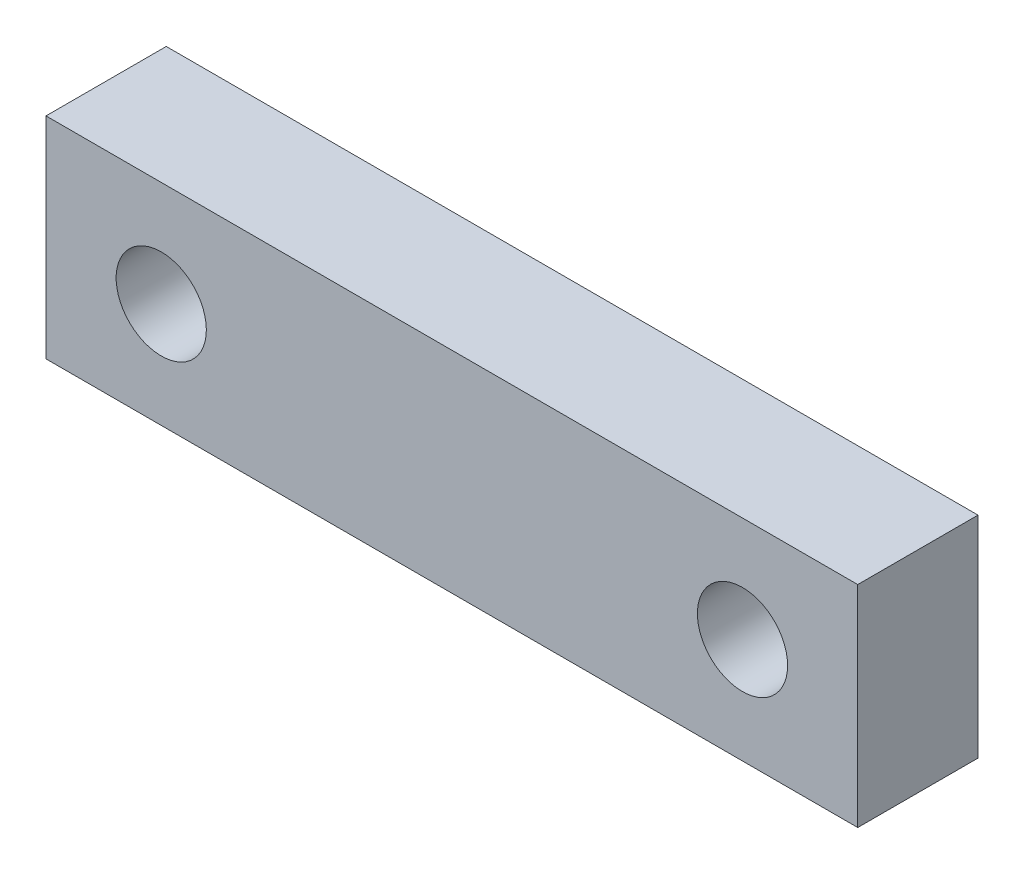
ISO-10303-21;
HEADER;
FILE_DESCRIPTION(('STEP AP214'),'2;1');
FILE_NAME('part.step','',(''),(''),'','','');
FILE_SCHEMA(('AUTOMOTIVE_DESIGN { 1 0 10303 214 1 1 1 1 }'));
ENDSEC;
DATA;
#1=APPLICATION_CONTEXT('core data for automotive mechanical design processes');
#2=APPLICATION_PROTOCOL_DEFINITION('international standard','automotive_design',2000,#1);
#3=PRODUCT_CONTEXT('',#1,'mechanical');
#4=PRODUCT('Part','Part','',(#3));
#5=PRODUCT_RELATED_PRODUCT_CATEGORY('part','',(#4));
#6=PRODUCT_DEFINITION_FORMATION('','',#4);
#7=PRODUCT_DEFINITION_CONTEXT('part definition',#1,'design');
#8=PRODUCT_DEFINITION('design','',#6,#7);
#9=PRODUCT_DEFINITION_SHAPE('','',#8);
#10=(LENGTH_UNIT() NAMED_UNIT(*) SI_UNIT(.MILLI.,.METRE.));
#11=(NAMED_UNIT(*) PLANE_ANGLE_UNIT() SI_UNIT($,.RADIAN.));
#12=(NAMED_UNIT(*) SI_UNIT($,.STERADIAN.) SOLID_ANGLE_UNIT());
#13=UNCERTAINTY_MEASURE_WITH_UNIT(LENGTH_MEASURE(1.E-05),#10,'distance_accuracy_value','');
#14=(GEOMETRIC_REPRESENTATION_CONTEXT(3) GLOBAL_UNCERTAINTY_ASSIGNED_CONTEXT((#13)) GLOBAL_UNIT_ASSIGNED_CONTEXT((#10,
#11,#12)) REPRESENTATION_CONTEXT('',''));
#15=CARTESIAN_POINT('',(0.,0.,0.));
#16=DIRECTION('',(0.,0.,1.));
#17=DIRECTION('',(1.,0.,0.));
#18=AXIS2_PLACEMENT_3D('',#15,#16,#17);
#19=CARTESIAN_POINT('',(-20.25,5.25,-3.));
#20=DIRECTION('',(-1.,0.,0.));
#21=DIRECTION('',(0.,0.,1.));
#22=AXIS2_PLACEMENT_3D('',#19,#20,#21);
#23=PLANE('',#22);
#24=DIRECTION('',(0.,0.,1.));
#25=VECTOR('',#24,1.);
#26=CARTESIAN_POINT('',(-20.25,-5.25,-3.));
#27=LINE('',#26,#25);
#28=CARTESIAN_POINT('',(-20.25,-5.25,-3.));
#29=VERTEX_POINT('',#28);
#30=CARTESIAN_POINT('',(-20.25,-5.25,3.));
#31=VERTEX_POINT('',#30);
#32=EDGE_CURVE('E38',#29,#31,#27,.T.);
#33=ORIENTED_EDGE('',*,*,#32,.T.);
#34=DIRECTION('',(0.,-1.,0.));
#35=VECTOR('',#34,1.);
#36=CARTESIAN_POINT('',(-20.25,5.25,3.));
#37=LINE('',#36,#35);
#38=CARTESIAN_POINT('',(-20.25,5.25,3.));
#39=VERTEX_POINT('',#38);
#40=EDGE_CURVE('E75',#39,#31,#37,.T.);
#41=ORIENTED_EDGE('',*,*,#40,.F.);
#42=DIRECTION('',(0.,0.,1.));
#43=VECTOR('',#42,1.);
#44=CARTESIAN_POINT('',(-20.25,5.25,-3.));
#45=LINE('',#44,#43);
#46=CARTESIAN_POINT('',(-20.25,5.25,-3.));
#47=VERTEX_POINT('',#46);
#48=EDGE_CURVE('E11',#47,#39,#45,.T.);
#49=ORIENTED_EDGE('',*,*,#48,.F.);
#50=DIRECTION('',(0.,-1.,0.));
#51=VECTOR('',#50,1.);
#52=CARTESIAN_POINT('',(-20.25,5.25,-3.));
#53=LINE('',#52,#51);
#54=EDGE_CURVE('E76',#47,#29,#53,.T.);
#55=ORIENTED_EDGE('',*,*,#54,.T.);
#56=EDGE_LOOP('',(#33,#41,#49,#55));
#57=FACE_BOUND('',#56,.T.);
#58=ADVANCED_FACE('F35',(#57),#23,.T.);
#59=CARTESIAN_POINT('',(-20.25,5.25,-3.));
#60=DIRECTION('',(0.,1.,0.));
#61=DIRECTION('',(0.,0.,1.));
#62=AXIS2_PLACEMENT_3D('',#59,#60,#61);
#63=PLANE('',#62);
#64=ORIENTED_EDGE('',*,*,#48,.T.);
#65=DIRECTION('',(-1.,0.,0.));
#66=VECTOR('',#65,1.);
#67=CARTESIAN_POINT('',(-20.25,5.25,3.));
#68=LINE('',#67,#66);
#69=CARTESIAN_POINT('',(20.25,5.25,3.));
#70=VERTEX_POINT('',#69);
#71=EDGE_CURVE('E93',#70,#39,#68,.T.);
#72=ORIENTED_EDGE('',*,*,#71,.F.);
#73=DIRECTION('',(0.,0.,1.));
#74=VECTOR('',#73,1.);
#75=CARTESIAN_POINT('',(20.25,5.25,-3.));
#76=LINE('',#75,#74);
#77=CARTESIAN_POINT('',(20.25,5.25,-3.));
#78=VERTEX_POINT('',#77);
#79=EDGE_CURVE('E43',#78,#70,#76,.T.);
#80=ORIENTED_EDGE('',*,*,#79,.F.);
#81=DIRECTION('',(-1.,0.,0.));
#82=VECTOR('',#81,1.);
#83=CARTESIAN_POINT('',(-20.25,5.25,-3.));
#84=LINE('',#83,#82);
#85=EDGE_CURVE('E81',#78,#47,#84,.T.);
#86=ORIENTED_EDGE('',*,*,#85,.T.);
#87=EDGE_LOOP('',(#64,#72,#80,#86));
#88=FACE_BOUND('',#87,.T.);
#89=ADVANCED_FACE('F119',(#88),#63,.T.);
#90=CARTESIAN_POINT('',(20.25,5.25,-3.));
#91=DIRECTION('',(1.,0.,0.));
#92=DIRECTION('',(0.,0.,-1.));
#93=AXIS2_PLACEMENT_3D('',#90,#91,#92);
#94=PLANE('',#93);
#95=ORIENTED_EDGE('',*,*,#79,.T.);
#96=DIRECTION('',(0.,1.,0.));
#97=VECTOR('',#96,1.);
#98=CARTESIAN_POINT('',(20.25,5.25,3.));
#99=LINE('',#98,#97);
#100=CARTESIAN_POINT('',(20.25,-5.25,3.));
#101=VERTEX_POINT('',#100);
#102=EDGE_CURVE('E88',#101,#70,#99,.T.);
#103=ORIENTED_EDGE('',*,*,#102,.F.);
#104=DIRECTION('',(0.,0.,1.));
#105=VECTOR('',#104,1.);
#106=CARTESIAN_POINT('',(20.25,-5.25,-3.));
#107=LINE('',#106,#105);
#108=CARTESIAN_POINT('',(20.25,-5.25,-3.));
#109=VERTEX_POINT('',#108);
#110=EDGE_CURVE('E80',#109,#101,#107,.T.);
#111=ORIENTED_EDGE('',*,*,#110,.F.);
#112=DIRECTION('',(0.,1.,0.));
#113=VECTOR('',#112,1.);
#114=CARTESIAN_POINT('',(20.25,5.25,-3.));
#115=LINE('',#114,#113);
#116=EDGE_CURVE('E112',#109,#78,#115,.T.);
#117=ORIENTED_EDGE('',*,*,#116,.T.);
#118=EDGE_LOOP('',(#95,#103,#111,#117));
#119=FACE_BOUND('',#118,.T.);
#120=ADVANCED_FACE('F116',(#119),#94,.T.);
#121=CARTESIAN_POINT('',(-20.25,-5.25,-3.));
#122=DIRECTION('',(0.,-1.,0.));
#123=DIRECTION('',(0.,0.,-1.));
#124=AXIS2_PLACEMENT_3D('',#121,#122,#123);
#125=PLANE('',#124);
#126=ORIENTED_EDGE('',*,*,#110,.T.);
#127=DIRECTION('',(1.,0.,0.));
#128=VECTOR('',#127,1.);
#129=CARTESIAN_POINT('',(-20.25,-5.25,3.));
#130=LINE('',#129,#128);
#131=EDGE_CURVE('E83',#31,#101,#130,.T.);
#132=ORIENTED_EDGE('',*,*,#131,.F.);
#133=ORIENTED_EDGE('',*,*,#32,.F.);
#134=DIRECTION('',(1.,0.,0.));
#135=VECTOR('',#134,1.);
#136=CARTESIAN_POINT('',(-20.25,-5.25,-3.));
#137=LINE('',#136,#135);
#138=EDGE_CURVE('E110',#29,#109,#137,.T.);
#139=ORIENTED_EDGE('',*,*,#138,.T.);
#140=EDGE_LOOP('',(#126,#132,#133,#139));
#141=FACE_BOUND('',#140,.T.);
#142=ADVANCED_FACE('F84',(#141),#125,.T.);
#143=CARTESIAN_POINT('',(0.,0.,-3.));
#144=DIRECTION('',(0.,0.,1.));
#145=DIRECTION('',(1.,0.,0.));
#146=AXIS2_PLACEMENT_3D('',#143,#144,#145);
#147=PLANE('',#146);
#148=CARTESIAN_POINT('',(14.5,0.,-3.));
#149=DIRECTION('',(0.,0.,1.));
#150=DIRECTION('',(1.,0.,0.));
#151=AXIS2_PLACEMENT_3D('',#148,#149,#150);
#152=CIRCLE('',#151,2.25);
#153=CARTESIAN_POINT('',(16.75,0.,-3.));
#154=VERTEX_POINT('',#153);
#155=EDGE_CURVE('E103',#154,#154,#152,.T.);
#156=ORIENTED_EDGE('',*,*,#155,.T.);
#157=EDGE_LOOP('',(#156));
#158=FACE_BOUND('',#157,.T.);
#159=CARTESIAN_POINT('',(-14.5,0.,-3.));
#160=DIRECTION('',(0.,0.,1.));
#161=DIRECTION('',(1.,0.,0.));
#162=AXIS2_PLACEMENT_3D('',#159,#160,#161);
#163=CIRCLE('',#162,2.25);
#164=CARTESIAN_POINT('',(-12.25,0.,-3.));
#165=VERTEX_POINT('',#164);
#166=EDGE_CURVE('E106',#165,#165,#163,.T.);
#167=ORIENTED_EDGE('',*,*,#166,.T.);
#168=EDGE_LOOP('',(#167));
#169=FACE_BOUND('',#168,.T.);
#170=ORIENTED_EDGE('',*,*,#54,.F.);
#171=ORIENTED_EDGE('',*,*,#85,.F.);
#172=ORIENTED_EDGE('',*,*,#116,.F.);
#173=ORIENTED_EDGE('',*,*,#138,.F.);
#174=EDGE_LOOP('',(#170,#171,#172,#173));
#175=FACE_BOUND('',#174,.T.);
#176=ADVANCED_FACE('F121',(#158,#169,#175),#147,.F.);
#177=CARTESIAN_POINT('',(-14.5,0.,-3.));
#178=DIRECTION('',(0.,0.,1.));
#179=DIRECTION('',(1.,0.,0.));
#180=AXIS2_PLACEMENT_3D('',#177,#178,#179);
#181=CYLINDRICAL_SURFACE('',#180,2.25);
#182=ORIENTED_EDGE('',*,*,#166,.F.);
#183=EDGE_LOOP('',(#182));
#184=FACE_BOUND('',#183,.T.);
#185=CARTESIAN_POINT('',(-14.5,0.,3.));
#186=DIRECTION('',(0.,0.,1.));
#187=DIRECTION('',(1.,0.,0.));
#188=AXIS2_PLACEMENT_3D('',#185,#186,#187);
#189=CIRCLE('',#188,2.25);
#190=CARTESIAN_POINT('',(-12.25,0.,3.));
#191=VERTEX_POINT('',#190);
#192=EDGE_CURVE('E94',#191,#191,#189,.T.);
#193=ORIENTED_EDGE('',*,*,#192,.T.);
#194=EDGE_LOOP('',(#193));
#195=FACE_BOUND('',#194,.T.);
#196=ADVANCED_FACE('F123',(#184,#195),#181,.F.);
#197=CARTESIAN_POINT('',(14.5,0.,-3.));
#198=DIRECTION('',(0.,0.,1.));
#199=DIRECTION('',(1.,0.,0.));
#200=AXIS2_PLACEMENT_3D('',#197,#198,#199);
#201=CYLINDRICAL_SURFACE('',#200,2.25);
#202=ORIENTED_EDGE('',*,*,#155,.F.);
#203=EDGE_LOOP('',(#202));
#204=FACE_BOUND('',#203,.T.);
#205=CARTESIAN_POINT('',(14.5,0.,3.));
#206=DIRECTION('',(0.,0.,1.));
#207=DIRECTION('',(1.,0.,0.));
#208=AXIS2_PLACEMENT_3D('',#205,#206,#207);
#209=CIRCLE('',#208,2.25);
#210=CARTESIAN_POINT('',(16.75,0.,3.));
#211=VERTEX_POINT('',#210);
#212=EDGE_CURVE('E97',#211,#211,#209,.T.);
#213=ORIENTED_EDGE('',*,*,#212,.T.);
#214=EDGE_LOOP('',(#213));
#215=FACE_BOUND('',#214,.T.);
#216=ADVANCED_FACE('F130',(#204,#215),#201,.F.);
#217=CARTESIAN_POINT('',(0.,0.,3.));
#218=DIRECTION('',(0.,0.,1.));
#219=DIRECTION('',(1.,0.,0.));
#220=AXIS2_PLACEMENT_3D('',#217,#218,#219);
#221=PLANE('',#220);
#222=ORIENTED_EDGE('',*,*,#192,.F.);
#223=EDGE_LOOP('',(#222));
#224=FACE_BOUND('',#223,.T.);
#225=ORIENTED_EDGE('',*,*,#40,.T.);
#226=ORIENTED_EDGE('',*,*,#131,.T.);
#227=ORIENTED_EDGE('',*,*,#102,.T.);
#228=ORIENTED_EDGE('',*,*,#71,.T.);
#229=EDGE_LOOP('',(#225,#226,#227,#228));
#230=FACE_BOUND('',#229,.T.);
#231=ORIENTED_EDGE('',*,*,#212,.F.);
#232=EDGE_LOOP('',(#231));
#233=FACE_BOUND('',#232,.T.);
#234=ADVANCED_FACE('F91',(#224,#230,#233),#221,.T.);
#235=CLOSED_SHELL('',(#58,#89,#120,#142,#176,#196,#216,#234));
#236=MANIFOLD_SOLID_BREP('B2',#235);
#237=ADVANCED_BREP_SHAPE_REPRESENTATION('',(#18,#236),#14);
#238=SHAPE_DEFINITION_REPRESENTATION(#9,#237);
ENDSEC;
END-ISO-10303-21;
